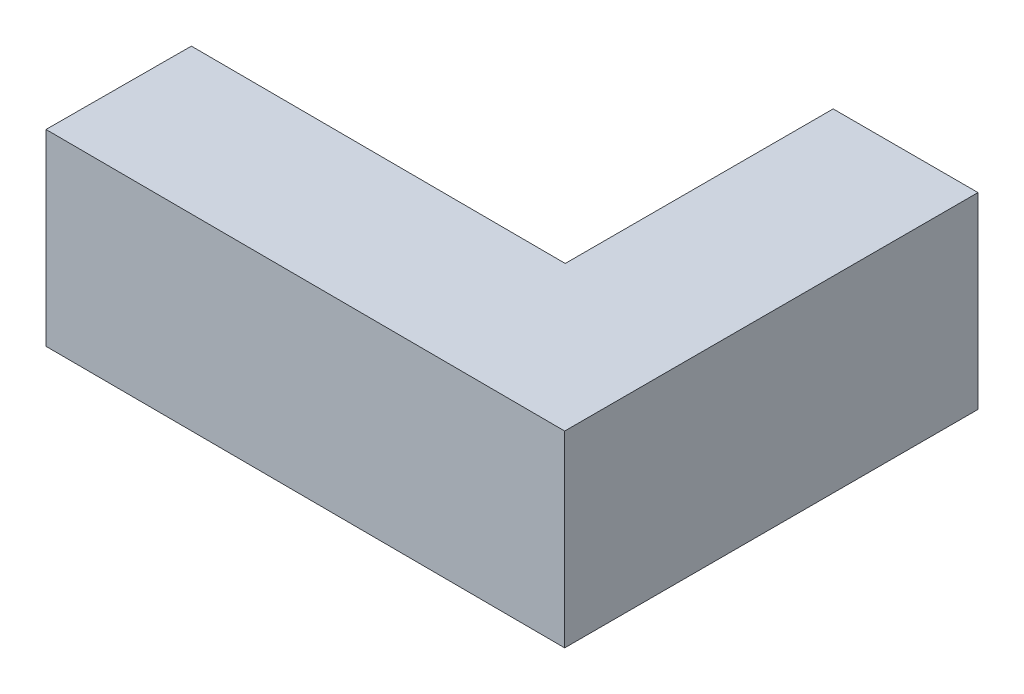
ISO-10303-21;
HEADER;
FILE_DESCRIPTION(('STEP AP214'),'2;1');
FILE_NAME('part.step','',(''),(''),'','','');
FILE_SCHEMA(('AUTOMOTIVE_DESIGN { 1 0 10303 214 1 1 1 1 }'));
ENDSEC;
DATA;
#1=APPLICATION_CONTEXT('core data for automotive mechanical design processes');
#2=APPLICATION_PROTOCOL_DEFINITION('international standard','automotive_design',2000,#1);
#3=PRODUCT_CONTEXT('',#1,'mechanical');
#4=PRODUCT('Part','Part','',(#3));
#5=PRODUCT_RELATED_PRODUCT_CATEGORY('part','',(#4));
#6=PRODUCT_DEFINITION_FORMATION('','',#4);
#7=PRODUCT_DEFINITION_CONTEXT('part definition',#1,'design');
#8=PRODUCT_DEFINITION('design','',#6,#7);
#9=PRODUCT_DEFINITION_SHAPE('','',#8);
#10=(LENGTH_UNIT() NAMED_UNIT(*) SI_UNIT(.MILLI.,.METRE.));
#11=(NAMED_UNIT(*) PLANE_ANGLE_UNIT() SI_UNIT($,.RADIAN.));
#12=(NAMED_UNIT(*) SI_UNIT($,.STERADIAN.) SOLID_ANGLE_UNIT());
#13=UNCERTAINTY_MEASURE_WITH_UNIT(LENGTH_MEASURE(1.E-05),#10,'distance_accuracy_value','');
#14=(GEOMETRIC_REPRESENTATION_CONTEXT(3) GLOBAL_UNCERTAINTY_ASSIGNED_CONTEXT((#13)) GLOBAL_UNIT_ASSIGNED_CONTEXT((#10,
#11,#12)) REPRESENTATION_CONTEXT('',''));
#15=CARTESIAN_POINT('',(0.,0.,0.));
#16=DIRECTION('',(0.,0.,1.));
#17=DIRECTION('',(1.,0.,0.));
#18=AXIS2_PLACEMENT_3D('',#15,#16,#17);
#19=CARTESIAN_POINT('',(40.4002330457357,-4.75,27.8675995297768));
#20=DIRECTION('',(0.999993768643483,0.,0.00353025129487873));
#21=DIRECTION('',(0.00353025129487873,0.,-0.999993768643483));
#22=AXIS2_PLACEMENT_3D('',#19,#20,#21);
#23=PLANE('',#22);
#24=DIRECTION('',(0.00353025129487873,0.,-0.999993768643483));
#25=VECTOR('',#24,1.);
#26=CARTESIAN_POINT('',(40.4002330457357,2.25,27.8675995297768));
#27=LINE('',#26,#25);
#28=CARTESIAN_POINT('',(40.4002330457357,2.25,27.8675995297768));
#29=VERTEX_POINT('',#28);
#30=CARTESIAN_POINT('',(40.4192964027281,2.25,22.467633179102));
#31=VERTEX_POINT('',#30);
#32=EDGE_CURVE('E120',#29,#31,#27,.T.);
#33=ORIENTED_EDGE('',*,*,#32,.T.);
#34=DIRECTION('',(0.,1.,0.));
#35=VECTOR('',#34,1.);
#36=CARTESIAN_POINT('',(40.4192964027281,-4.75,22.467633179102));
#37=LINE('',#36,#35);
#38=CARTESIAN_POINT('',(40.4192964027281,-4.75,22.467633179102));
#39=VERTEX_POINT('',#38);
#40=EDGE_CURVE('E11',#39,#31,#37,.T.);
#41=ORIENTED_EDGE('',*,*,#40,.F.);
#42=DIRECTION('',(0.00353025129487873,0.,-0.999993768643483));
#43=VECTOR('',#42,1.);
#44=CARTESIAN_POINT('',(40.4002330457357,-4.75,27.8675995297768));
#45=LINE('',#44,#43);
#46=CARTESIAN_POINT('',(40.4002330457357,-4.75,27.8675995297768));
#47=VERTEX_POINT('',#46);
#48=EDGE_CURVE('E130',#47,#39,#45,.T.);
#49=ORIENTED_EDGE('',*,*,#48,.F.);
#50=DIRECTION('',(0.,1.,0.));
#51=VECTOR('',#50,1.);
#52=CARTESIAN_POINT('',(40.4002330457357,-4.75,27.8675995297768));
#53=LINE('',#52,#51);
#54=EDGE_CURVE('E116',#47,#29,#53,.T.);
#55=ORIENTED_EDGE('',*,*,#54,.T.);
#56=EDGE_LOOP('',(#33,#41,#49,#55));
#57=FACE_BOUND('',#56,.T.);
#58=ADVANCED_FACE('F36',(#57),#23,.F.);
#59=CARTESIAN_POINT('',(40.4192964027281,-4.75,22.467633179102));
#60=DIRECTION('',(-0.00353025129487849,0.,0.999993768643483));
#61=DIRECTION('',(0.999993768643483,0.,0.00353025129487849));
#62=AXIS2_PLACEMENT_3D('',#59,#60,#61);
#63=PLANE('',#62);
#64=DIRECTION('',(0.999993768643483,0.,0.00353025129487849));
#65=VECTOR('',#64,1.);
#66=CARTESIAN_POINT('',(40.4192964027281,2.25,22.467633179102));
#67=LINE('',#66,#65);
#68=CARTESIAN_POINT('',(54.4012276051989,2.25,22.5169932174144));
#69=VERTEX_POINT('',#68);
#70=EDGE_CURVE('E123',#31,#69,#67,.T.);
#71=ORIENTED_EDGE('',*,*,#70,.T.);
#72=DIRECTION('',(0.,1.,0.));
#73=VECTOR('',#72,1.);
#74=CARTESIAN_POINT('',(54.4012276051989,-4.75,22.5169932174144));
#75=LINE('',#74,#73);
#76=CARTESIAN_POINT('',(54.4012276051989,-4.75,22.5169932174144));
#77=VERTEX_POINT('',#76);
#78=EDGE_CURVE('E44',#77,#69,#75,.T.);
#79=ORIENTED_EDGE('',*,*,#78,.F.);
#80=DIRECTION('',(0.999993768643483,0.,0.00353025129487849));
#81=VECTOR('',#80,1.);
#82=CARTESIAN_POINT('',(40.4192964027281,-4.75,22.467633179102));
#83=LINE('',#82,#81);
#84=EDGE_CURVE('E89',#39,#77,#83,.T.);
#85=ORIENTED_EDGE('',*,*,#84,.F.);
#86=ORIENTED_EDGE('',*,*,#40,.T.);
#87=EDGE_LOOP('',(#71,#79,#85,#86));
#88=FACE_BOUND('',#87,.T.);
#89=ADVANCED_FACE('F154',(#88),#63,.F.);
#90=CARTESIAN_POINT('',(54.4012276051989,-4.75,22.5169932174144));
#91=DIRECTION('',(0.99999993564746,0.,0.000358754896831561));
#92=DIRECTION('',(0.000358754896831561,0.,-0.99999993564746));
#93=AXIS2_PLACEMENT_3D('',#90,#91,#92);
#94=PLANE('',#93);
#95=DIRECTION('',(0.000358754896831561,0.,-0.99999993564746));
#96=VECTOR('',#95,1.);
#97=CARTESIAN_POINT('',(54.4012276051989,2.25,22.5169932174144));
#98=LINE('',#97,#96);
#99=CARTESIAN_POINT('',(54.4048086588133,2.25,12.5350991286291));
#100=VERTEX_POINT('',#99);
#101=EDGE_CURVE('E125',#69,#100,#98,.T.);
#102=ORIENTED_EDGE('',*,*,#101,.T.);
#103=DIRECTION('',(0.,1.,0.));
#104=VECTOR('',#103,1.);
#105=CARTESIAN_POINT('',(54.4048086588133,-4.75,12.5350991286291));
#106=LINE('',#105,#104);
#107=CARTESIAN_POINT('',(54.4048086588133,-4.75,12.5350991286291));
#108=VERTEX_POINT('',#107);
#109=EDGE_CURVE('E111',#108,#100,#106,.T.);
#110=ORIENTED_EDGE('',*,*,#109,.F.);
#111=DIRECTION('',(0.000358754896831561,0.,-0.99999993564746));
#112=VECTOR('',#111,1.);
#113=CARTESIAN_POINT('',(54.4012276051989,-4.75,22.5169932174144));
#114=LINE('',#113,#112);
#115=EDGE_CURVE('E102',#77,#108,#114,.T.);
#116=ORIENTED_EDGE('',*,*,#115,.F.);
#117=ORIENTED_EDGE('',*,*,#78,.T.);
#118=EDGE_LOOP('',(#102,#110,#116,#117));
#119=FACE_BOUND('',#118,.T.);
#120=ADVANCED_FACE('F136',(#119),#94,.F.);
#121=CARTESIAN_POINT('',(54.4048086588133,-4.75,12.5350991286291));
#122=DIRECTION('',(-0.000358754896832743,0.,0.99999993564746));
#123=DIRECTION('',(0.99999993564746,0.,0.000358754896832743));
#124=AXIS2_PLACEMENT_3D('',#121,#122,#123);
#125=PLANE('',#124);
#126=DIRECTION('',(0.99999993564746,0.,0.000358754896832743));
#127=VECTOR('',#126,1.);
#128=CARTESIAN_POINT('',(54.4048086588133,2.25,12.5350991286291));
#129=LINE('',#128,#127);
#130=CARTESIAN_POINT('',(59.8048083113096,2.25,12.537036405072));
#131=VERTEX_POINT('',#130);
#132=EDGE_CURVE('E110',#100,#131,#129,.T.);
#133=ORIENTED_EDGE('',*,*,#132,.T.);
#134=DIRECTION('',(0.,1.,0.));
#135=VECTOR('',#134,1.);
#136=CARTESIAN_POINT('',(59.8048083113096,-4.75,12.537036405072));
#137=LINE('',#136,#135);
#138=CARTESIAN_POINT('',(59.8048083113096,-4.75,12.537036405072));
#139=VERTEX_POINT('',#138);
#140=EDGE_CURVE('E107',#139,#131,#137,.T.);
#141=ORIENTED_EDGE('',*,*,#140,.F.);
#142=DIRECTION('',(0.99999993564746,0.,0.000358754896832743));
#143=VECTOR('',#142,1.);
#144=CARTESIAN_POINT('',(54.4048086588133,-4.75,12.5350991286291));
#145=LINE('',#144,#143);
#146=EDGE_CURVE('E96',#108,#139,#145,.T.);
#147=ORIENTED_EDGE('',*,*,#146,.F.);
#148=ORIENTED_EDGE('',*,*,#109,.T.);
#149=EDGE_LOOP('',(#133,#141,#147,#148));
#150=FACE_BOUND('',#149,.T.);
#151=ADVANCED_FACE('F108',(#150),#125,.F.);
#152=CARTESIAN_POINT('',(59.8048083113096,-4.75,12.537036405072));
#153=DIRECTION('',(-0.99999993564746,0.,-0.000358754896832192));
#154=DIRECTION('',(-0.000358754896832192,0.,0.99999993564746));
#155=AXIS2_PLACEMENT_3D('',#152,#153,#154);
#156=PLANE('',#155);
#157=DIRECTION('',(-0.000358754896832192,0.,0.99999993564746));
#158=VECTOR('',#157,1.);
#159=CARTESIAN_POINT('',(59.8048083113096,2.25,12.537036405072));
#160=LINE('',#159,#158);
#161=CARTESIAN_POINT('',(59.7992838274092,2.25,27.9360834806662));
#162=VERTEX_POINT('',#161);
#163=EDGE_CURVE('E75',#131,#162,#160,.T.);
#164=ORIENTED_EDGE('',*,*,#163,.T.);
#165=DIRECTION('',(0.,1.,0.));
#166=VECTOR('',#165,1.);
#167=CARTESIAN_POINT('',(59.7992838274092,-4.75,27.9360834806662));
#168=LINE('',#167,#166);
#169=CARTESIAN_POINT('',(59.7992838274092,-4.75,27.9360834806662));
#170=VERTEX_POINT('',#169);
#171=EDGE_CURVE('E112',#170,#162,#168,.T.);
#172=ORIENTED_EDGE('',*,*,#171,.F.);
#173=DIRECTION('',(-0.000358754896832192,0.,0.99999993564746));
#174=VECTOR('',#173,1.);
#175=CARTESIAN_POINT('',(59.8048083113096,-4.75,12.537036405072));
#176=LINE('',#175,#174);
#177=EDGE_CURVE('E100',#139,#170,#176,.T.);
#178=ORIENTED_EDGE('',*,*,#177,.F.);
#179=ORIENTED_EDGE('',*,*,#140,.T.);
#180=EDGE_LOOP('',(#164,#172,#178,#179));
#181=FACE_BOUND('',#180,.T.);
#182=ADVANCED_FACE('F114',(#181),#156,.F.);
#183=CARTESIAN_POINT('',(59.7992838274092,-4.75,27.9360834806662));
#184=DIRECTION('',(0.0035302512948785,0.,-0.999993768643483));
#185=DIRECTION('',(-0.999993768643483,0.,-0.0035302512948785));
#186=AXIS2_PLACEMENT_3D('',#183,#184,#185);
#187=PLANE('',#186);
#188=DIRECTION('',(-0.999993768643483,0.,-0.0035302512948785));
#189=VECTOR('',#188,1.);
#190=CARTESIAN_POINT('',(59.7992838274092,2.25,27.9360834806662));
#191=LINE('',#190,#189);
#192=EDGE_CURVE('E81',#162,#29,#191,.T.);
#193=ORIENTED_EDGE('',*,*,#192,.T.);
#194=ORIENTED_EDGE('',*,*,#54,.F.);
#195=DIRECTION('',(-0.999993768643483,0.,-0.0035302512948785));
#196=VECTOR('',#195,1.);
#197=CARTESIAN_POINT('',(59.7992838274092,-4.75,27.9360834806662));
#198=LINE('',#197,#196);
#199=EDGE_CURVE('E52',#170,#47,#198,.T.);
#200=ORIENTED_EDGE('',*,*,#199,.F.);
#201=ORIENTED_EDGE('',*,*,#171,.T.);
#202=EDGE_LOOP('',(#193,#194,#200,#201));
#203=FACE_BOUND('',#202,.T.);
#204=ADVANCED_FACE('F143',(#203),#187,.F.);
#205=CARTESIAN_POINT('',(0.,-4.75,0.));
#206=DIRECTION('',(0.,-1.,0.));
#207=DIRECTION('',(0.,0.,-1.));
#208=AXIS2_PLACEMENT_3D('',#205,#206,#207);
#209=PLANE('',#208);
#210=ORIENTED_EDGE('',*,*,#48,.T.);
#211=ORIENTED_EDGE('',*,*,#84,.T.);
#212=ORIENTED_EDGE('',*,*,#115,.T.);
#213=ORIENTED_EDGE('',*,*,#146,.T.);
#214=ORIENTED_EDGE('',*,*,#177,.T.);
#215=ORIENTED_EDGE('',*,*,#199,.T.);
#216=EDGE_LOOP('',(#210,#211,#212,#213,#214,#215));
#217=FACE_BOUND('',#216,.T.);
#218=ADVANCED_FACE('F98',(#217),#209,.T.);
#219=CARTESIAN_POINT('',(0.,2.25,0.));
#220=DIRECTION('',(0.,-1.,0.));
#221=DIRECTION('',(0.,0.,-1.));
#222=AXIS2_PLACEMENT_3D('',#219,#220,#221);
#223=PLANE('',#222);
#224=ORIENTED_EDGE('',*,*,#32,.F.);
#225=ORIENTED_EDGE('',*,*,#192,.F.);
#226=ORIENTED_EDGE('',*,*,#163,.F.);
#227=ORIENTED_EDGE('',*,*,#132,.F.);
#228=ORIENTED_EDGE('',*,*,#101,.F.);
#229=ORIENTED_EDGE('',*,*,#70,.F.);
#230=EDGE_LOOP('',(#224,#225,#226,#227,#228,#229));
#231=FACE_BOUND('',#230,.T.);
#232=ADVANCED_FACE('F139',(#231),#223,.F.);
#233=CLOSED_SHELL('',(#58,#89,#120,#151,#182,#204,#218,#232));
#234=MANIFOLD_SOLID_BREP('B2',#233);
#235=ADVANCED_BREP_SHAPE_REPRESENTATION('',(#18,#234),#14);
#236=SHAPE_DEFINITION_REPRESENTATION(#9,#235);
ENDSEC;
END-ISO-10303-21;
